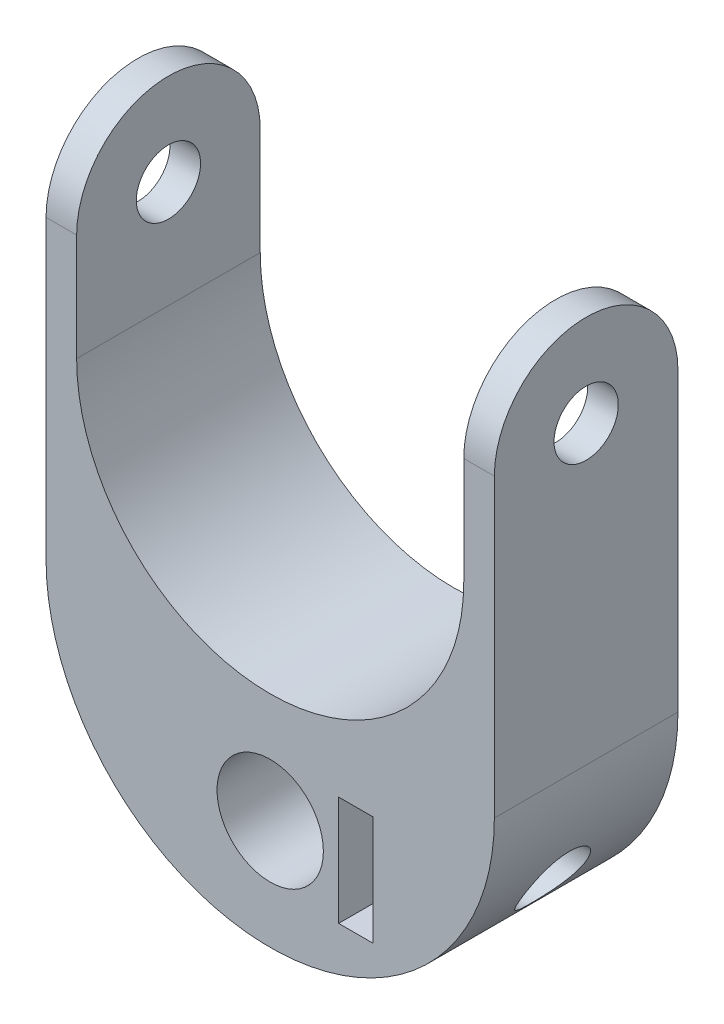
ISO-10303-21;
HEADER;
FILE_DESCRIPTION(('STEP AP214'),'2;1');
FILE_NAME('part.step','',(''),(''),'','','');
FILE_SCHEMA(('AUTOMOTIVE_DESIGN { 1 0 10303 214 1 1 1 1 }'));
ENDSEC;
DATA;
#1=APPLICATION_CONTEXT('core data for automotive mechanical design processes');
#2=APPLICATION_PROTOCOL_DEFINITION('international standard','automotive_design',2000,#1);
#3=PRODUCT_CONTEXT('',#1,'mechanical');
#4=PRODUCT('Part','Part','',(#3));
#5=PRODUCT_RELATED_PRODUCT_CATEGORY('part','',(#4));
#6=PRODUCT_DEFINITION_FORMATION('','',#4);
#7=PRODUCT_DEFINITION_CONTEXT('part definition',#1,'design');
#8=PRODUCT_DEFINITION('design','',#6,#7);
#9=PRODUCT_DEFINITION_SHAPE('','',#8);
#10=(LENGTH_UNIT() NAMED_UNIT(*) SI_UNIT(.MILLI.,.METRE.));
#11=(NAMED_UNIT(*) PLANE_ANGLE_UNIT() SI_UNIT($,.RADIAN.));
#12=(NAMED_UNIT(*) SI_UNIT($,.STERADIAN.) SOLID_ANGLE_UNIT());
#13=UNCERTAINTY_MEASURE_WITH_UNIT(LENGTH_MEASURE(1.E-05),#10,'distance_accuracy_value','');
#14=(GEOMETRIC_REPRESENTATION_CONTEXT(3) GLOBAL_UNCERTAINTY_ASSIGNED_CONTEXT((#13)) GLOBAL_UNIT_ASSIGNED_CONTEXT((#10,
#11,#12)) REPRESENTATION_CONTEXT('',''));
#15=CARTESIAN_POINT('',(0.,0.,0.));
#16=DIRECTION('',(0.,0.,1.));
#17=DIRECTION('',(1.,0.,0.));
#18=AXIS2_PLACEMENT_3D('',#15,#16,#17);
#19=CARTESIAN_POINT('',(0.,-5.35000000000001,12.));
#20=DIRECTION('',(0.,0.,-1.));
#21=DIRECTION('',(-1.,0.,0.));
#22=AXIS2_PLACEMENT_3D('',#19,#20,#21);
#23=CYLINDRICAL_SURFACE('',#22,14.65);
#24=CARTESIAN_POINT('',(0.,-5.35000000000001,0.));
#25=DIRECTION('',(0.,0.,1.));
#26=DIRECTION('',(1.,0.,0.));
#27=AXIS2_PLACEMENT_3D('',#24,#25,#26);
#28=CIRCLE('',#27,14.65);
#29=CARTESIAN_POINT('',(-14.65,-5.35,0.));
#30=VERTEX_POINT('',#29);
#31=CARTESIAN_POINT('',(14.65,-5.35,0.));
#32=VERTEX_POINT('',#31);
#33=EDGE_CURVE('E250',#30,#32,#28,.T.);
#34=ORIENTED_EDGE('',*,*,#33,.T.);
#35=DIRECTION('',(0.,0.,-1.));
#36=VECTOR('',#35,1.);
#37=CARTESIAN_POINT('',(14.65,-5.35,12.));
#38=LINE('',#37,#36);
#39=CARTESIAN_POINT('',(14.65,-5.35,12.));
#40=VERTEX_POINT('',#39);
#41=EDGE_CURVE('E266',#40,#32,#38,.T.);
#42=ORIENTED_EDGE('',*,*,#41,.F.);
#43=CARTESIAN_POINT('',(0.,-5.35000000000001,12.));
#44=DIRECTION('',(0.,0.,1.));
#45=DIRECTION('',(1.,0.,0.));
#46=AXIS2_PLACEMENT_3D('',#43,#44,#45);
#47=CIRCLE('',#46,14.65);
#48=CARTESIAN_POINT('',(-14.65,-5.35,12.));
#49=VERTEX_POINT('',#48);
#50=EDGE_CURVE('E233',#49,#40,#47,.T.);
#51=ORIENTED_EDGE('',*,*,#50,.F.);
#52=DIRECTION('',(0.,0.,-1.));
#53=VECTOR('',#52,1.);
#54=CARTESIAN_POINT('',(-14.65,-5.35,12.));
#55=LINE('',#54,#53);
#56=EDGE_CURVE('E269',#49,#30,#55,.T.);
#57=ORIENTED_EDGE('',*,*,#56,.T.);
#58=EDGE_LOOP('',(#34,#42,#51,#57));
#59=FACE_BOUND('',#58,.T.);
#60=CARTESIAN_POINT('',(13.6381816969859,-10.7,6.075));
#61=CARTESIAN_POINT('',(13.6381818577953,-10.6999997619216,6.18769592040529));
#62=CARTESIAN_POINT('',(13.6346630418073,-10.7089959253899,6.30039352296574));
#63=CARTESIAN_POINT('',(13.6206093448513,-10.7446140347678,6.52251853197071));
#64=CARTESIAN_POINT('',(13.610073919306,-10.7712373487657,6.63194568389816));
#65=CARTESIAN_POINT('',(13.5820759585504,-10.8410027991601,6.84432555055061));
#66=CARTESIAN_POINT('',(13.5646203092123,-10.8841285135943,6.94728458366681));
#67=CARTESIAN_POINT('',(13.5229397911344,-10.9852084332464,7.1441290452958));
#68=CARTESIAN_POINT('',(13.4987147387791,-11.0431630406846,7.23801422759345));
#69=CARTESIAN_POINT('',(13.4432080654823,-11.1730341139302,7.41628265225317));
#70=CARTESIAN_POINT('',(13.4117941209934,-11.2452083221933,7.50043637743475));
#71=CARTESIAN_POINT('',(13.3426264203627,-11.4001247207099,7.65530421032495));
#72=CARTESIAN_POINT('',(13.3048714448191,-11.4828689428789,7.72601572746477));
#73=CARTESIAN_POINT('',(13.2210359109427,-11.6616588660163,7.85693550890259));
#74=CARTESIAN_POINT('',(13.1745818981247,-11.758213169107,7.91620795309389));
#75=CARTESIAN_POINT('',(13.0759783957465,-11.9570887585952,8.01789608637373));
#76=CARTESIAN_POINT('',(13.0238267495519,-12.0594122215592,8.06030536414025));
#77=CARTESIAN_POINT('',(12.9093925221057,-12.2772393563958,8.13169051376206));
#78=CARTESIAN_POINT('',(12.8466180037451,-12.3930500061078,8.15893641107234));
#79=CARTESIAN_POINT('',(12.7166443724941,-12.625106883376,8.19383342562037));
#80=CARTESIAN_POINT('',(12.6494434721969,-12.741353268794,8.20147657674696));
#81=CARTESIAN_POINT('',(12.5037194092245,-12.9855775433663,8.19784956948757));
#82=CARTESIAN_POINT('',(12.424805685681,-13.1132878608272,8.18419795167279));
#83=CARTESIAN_POINT('',(12.2651174691782,-13.3632039763527,8.13466415688475));
#84=CARTESIAN_POINT('',(12.1843413588044,-13.4854046947377,8.09876189763443));
#85=CARTESIAN_POINT('',(12.0153828038357,-13.7331768672592,8.00120067306634));
#86=CARTESIAN_POINT('',(11.9272390736859,-13.8579326259775,7.9373877182541));
#87=CARTESIAN_POINT('',(11.7549451888421,-14.0944338378493,7.78495166703591));
#88=CARTESIAN_POINT('',(11.6707926560307,-14.206187097608,7.69634356741768));
#89=CARTESIAN_POINT('',(11.5297306701154,-14.3886892915543,7.51818284045546));
#90=CARTESIAN_POINT('',(11.4710311773009,-14.4629353678651,7.43362189426947));
#91=CARTESIAN_POINT('',(11.3616444861548,-14.5989523926377,7.25045032818825));
#92=CARTESIAN_POINT('',(11.3109447597664,-14.6607428901768,7.15186214562349));
#93=CARTESIAN_POINT('',(11.2298766677136,-14.7582726961813,6.96220300009554));
#94=CARTESIAN_POINT('',(11.197471545769,-14.7967423959774,6.87341488615511));
#95=CARTESIAN_POINT('',(11.1422693806021,-14.8617906519782,6.68873341822551));
#96=CARTESIAN_POINT('',(11.119465599557,-14.8883775478507,6.59284510261503));
#97=CARTESIAN_POINT('',(11.0852732488805,-14.9280963156938,6.39560336404526));
#98=CARTESIAN_POINT('',(11.0739609952478,-14.9411382472731,6.29421805462742));
#99=CARTESIAN_POINT('',(11.0641963862251,-14.9524020135628,6.09001701218399));
#100=CARTESIAN_POINT('',(11.0657386711715,-14.9506300248946,5.98720189316323));
#101=CARTESIAN_POINT('',(11.0806391746589,-14.933424688417,5.79483745430381));
#102=CARTESIAN_POINT('',(11.0927144170103,-14.9194745653258,5.70504655409754));
#103=CARTESIAN_POINT('',(11.125974867249,-14.8807831947313,5.52960622943799));
#104=CARTESIAN_POINT('',(11.1471615875259,-14.8560401557312,5.4439574951584));
#105=CARTESIAN_POINT('',(11.1984608614494,-14.7955602963951,5.2743605584242));
#106=CARTESIAN_POINT('',(11.2289621601351,-14.759341375658,5.19070465088623));
#107=CARTESIAN_POINT('',(11.2966752536619,-14.6779385526156,5.030821660794));
#108=CARTESIAN_POINT('',(11.3338920668399,-14.6327479434417,4.95460019988673));
#109=CARTESIAN_POINT('',(11.43231204544,-14.5115143705335,4.77582477030612));
#110=CARTESIAN_POINT('',(11.4965183239039,-14.4310056182378,4.67793339521184));
#111=CARTESIAN_POINT('',(11.6318298452881,-14.2570323817954,4.50005966604927));
#112=CARTESIAN_POINT('',(11.7029459318874,-14.1635474320531,4.42010613454492));
#113=CARTESIAN_POINT('',(11.8498835503259,-13.9649988580726,4.27745841067161));
#114=CARTESIAN_POINT('',(11.9257552409202,-13.8597972693325,4.21500898745246));
#115=CARTESIAN_POINT('',(12.078795297943,-13.6411417946528,4.10921990306699));
#116=CARTESIAN_POINT('',(12.1559635119425,-13.5276888736533,4.06587801157047));
#117=CARTESIAN_POINT('',(12.3212366210307,-13.2768789485465,3.99391320572146));
#118=CARTESIAN_POINT('',(12.409227158307,-13.1385045436946,3.96851519128338));
#119=CARTESIAN_POINT('',(12.5814872102261,-12.8570567518653,3.94555664678937));
#120=CARTESIAN_POINT('',(12.6657552634976,-12.7139815572217,3.94800695361157));
#121=CARTESIAN_POINT('',(12.8263176348531,-12.4305409571695,3.98215878301517));
#122=CARTESIAN_POINT('',(12.9027377858865,-12.2901786289499,4.01327388362695));
#123=CARTESIAN_POINT('',(13.047080301665,-12.0148550470874,4.10515499535342));
#124=CARTESIAN_POINT('',(13.1150108243851,-11.8798886944386,4.16589226197539));
#125=CARTESIAN_POINT('',(13.2328666547614,-11.637272389902,4.30799499988047));
#126=CARTESIAN_POINT('',(13.283970609951,-11.5282781377381,4.38608246284746));
#127=CARTESIAN_POINT('',(13.3766965762241,-11.3248624133218,4.56390545754581));
#128=CARTESIAN_POINT('',(13.4183268379757,-11.2304282839112,4.66362200344987));
#129=CARTESIAN_POINT('',(13.4867496846484,-11.071596180636,4.86839437123468));
#130=CARTESIAN_POINT('',(13.5147345305296,-11.0049368330417,4.97130386329456));
#131=CARTESIAN_POINT('',(13.5623354515674,-10.8898066313034,5.18858347918967));
#132=CARTESIAN_POINT('',(13.5819570563928,-10.8413237616646,5.3029459684723));
#133=CARTESIAN_POINT('',(13.6108942987721,-10.769169175805,5.52604155188967));
#134=CARTESIAN_POINT('',(13.6211219299528,-10.7433176728153,5.63395744921457));
#135=CARTESIAN_POINT('',(13.6347648666095,-10.7087349192348,5.85291544103542));
#136=CARTESIAN_POINT('',(13.6381815385349,-10.7000002345867,5.96395690393009));
#137=CARTESIAN_POINT('',(13.6381816969859,-10.7,6.075));
#138=B_SPLINE_CURVE_WITH_KNOTS('',3,(#60,#61,#62,#63,#64,#65,#66,#67,#68,#69,#70,#71,#72,#73,
#74,#75,#76,#77,#78,#79,#80,#81,#82,#83,#84,#85,#86,#87,#88,#89,#90,#91,#92,#93,#94,#95,#96,#97,
#98,#99,#100,#101,#102,#103,#104,#105,#106,#107,#108,#109,#110,#111,#112,#113,#114,#115,#116,
#117,#118,#119,#120,#121,#122,#123,#124,#125,#126,#127,#128,#129,#130,#131,#132,#133,#134,#135,
#136,#137),.UNSPECIFIED.,.T.,.F.,(4,2,2,2,2,2,2,2,2,2,2,2,2,2,2,2,2,2,2,2,2,2,2,2,2,2,2,2,2,2,2,
2,2,2,2,2,2,2,4),(0.,0.337682439300935,0.675391090073539,1.01276454859304,1.35014715903191,
1.69432634265536,2.03857178904914,2.40438860401935,2.77034436869361,3.17226811443252,
3.57435516699902,4.02472756617836,4.4755070413216,4.96985375011932,5.46390210824802,
5.8432923914678,6.22208250273881,6.527009874636,6.83172290304397,7.13844657633429,
7.44504236845139,7.71880682332976,7.99261673718104,8.27993331275058,8.56746548877962,
8.99140722412871,9.4160253475027,9.84631447539007,10.2765533643917,10.7719762402542,
11.2675919112601,11.7532882180636,12.2385141541468,12.6665087679083,13.0941292010936,
13.4694250934576,13.8444724585549,14.1772691434822,14.5099990543216),.UNSPECIFIED.);
#139=CARTESIAN_POINT('',(13.6381816969859,-10.7,6.075));
#140=VERTEX_POINT('',#139);
#141=EDGE_CURVE('E184',#140,#140,#138,.T.);
#142=ORIENTED_EDGE('',*,*,#141,.F.);
#143=EDGE_LOOP('',(#142));
#144=FACE_BOUND('',#143,.T.);
#145=ADVANCED_FACE('F66',(#59,#144),#23,.T.);
#146=CARTESIAN_POINT('',(0.,-12.825,12.));
#147=DIRECTION('',(0.,0.,-1.));
#148=DIRECTION('',(-1.,0.,0.));
#149=AXIS2_PLACEMENT_3D('',#146,#147,#148);
#150=CYLINDRICAL_SURFACE('',#149,3.475);
#151=CARTESIAN_POINT('',(0.,-12.825,0.));
#152=DIRECTION('',(0.,0.,1.));
#153=DIRECTION('',(1.,0.,0.));
#154=AXIS2_PLACEMENT_3D('',#151,#152,#153);
#155=CIRCLE('',#154,3.475);
#156=CARTESIAN_POINT('',(3.475,-12.825,0.));
#157=VERTEX_POINT('',#156);
#158=EDGE_CURVE('E226',#157,#157,#155,.T.);
#159=ORIENTED_EDGE('',*,*,#158,.F.);
#160=EDGE_LOOP('',(#159));
#161=FACE_BOUND('',#160,.T.);
#162=CARTESIAN_POINT('',(0.,-12.825,12.));
#163=DIRECTION('',(0.,0.,1.));
#164=DIRECTION('',(1.,0.,0.));
#165=AXIS2_PLACEMENT_3D('',#162,#163,#164);
#166=CIRCLE('',#165,3.475);
#167=CARTESIAN_POINT('',(3.475,-12.825,12.));
#168=VERTEX_POINT('',#167);
#169=EDGE_CURVE('E227',#168,#168,#166,.T.);
#170=ORIENTED_EDGE('',*,*,#169,.T.);
#171=EDGE_LOOP('',(#170));
#172=FACE_BOUND('',#171,.T.);
#173=CARTESIAN_POINT('',(2.74954541697351,-10.7,6.075));
#174=CARTESIAN_POINT('',(2.74955663550866,-10.7000073124976,6.18118933079543));
#175=CARTESIAN_POINT('',(2.75581041288415,-10.7080317626719,6.2875687626639));
#176=CARTESIAN_POINT('',(2.77975066762319,-10.7395804219011,6.49681047887194));
#177=CARTESIAN_POINT('',(2.7974711140295,-10.7631506881382,6.59966135376265));
#178=CARTESIAN_POINT('',(2.84142161463842,-10.8241668028883,6.79818137578376));
#179=CARTESIAN_POINT('',(2.86758040800459,-10.8614968159188,6.89390267867532));
#180=CARTESIAN_POINT('',(2.92533707753917,-10.9486324823229,7.0776057600308));
#181=CARTESIAN_POINT('',(2.95693465765566,-10.9984374567085,7.16558795936712));
#182=CARTESIAN_POINT('',(3.02688544143902,-11.1165288664044,7.34369186381119));
#183=CARTESIAN_POINT('',(3.06558600683897,-11.1863634648647,7.43265109772106));
#184=CARTESIAN_POINT('',(3.14258950929754,-11.3393675342977,7.59857142485001));
#185=CARTESIAN_POINT('',(3.18089208348308,-11.4225482017905,7.67552233595959));
#186=CARTESIAN_POINT('',(3.25794017578133,-11.6113370835735,7.82389667814463));
#187=CARTESIAN_POINT('',(3.29624124183253,-11.7184198275929,7.893697809387));
#188=CARTESIAN_POINT('',(3.36396675771904,-11.945596917334,8.01374421887085));
#189=CARTESIAN_POINT('',(3.39339966969831,-12.0656787094278,8.06400815321127));
#190=CARTESIAN_POINT('',(3.43747331427917,-12.3029824267362,8.13825494690161));
#191=CARTESIAN_POINT('',(3.45328375215388,-12.4193250451812,8.16433561577177));
#192=CARTESIAN_POINT('',(3.47289100064203,-12.6556937465318,8.19659025428263));
#193=CARTESIAN_POINT('',(3.47669970921447,-12.7757160622591,8.20278393907456));
#194=CARTESIAN_POINT('',(3.47219082722594,-12.9993656029482,8.19540195811891));
#195=CARTESIAN_POINT('',(3.46537026846804,-13.1031155614167,8.18426714246096));
#196=CARTESIAN_POINT('',(3.44294423097086,-13.306944157982,8.14721695089413));
#197=CARTESIAN_POINT('',(3.42733808877937,-13.4070225182065,8.12130045873006));
#198=CARTESIAN_POINT('',(3.38859791959663,-13.6014754160236,8.0557311603107));
#199=CARTESIAN_POINT('',(3.36543123650636,-13.6958230657459,8.01601871660944));
#200=CARTESIAN_POINT('',(3.31339664948914,-13.8766123886235,7.92432980681556));
#201=CARTESIAN_POINT('',(3.2845273511498,-13.9630521205435,7.87235034056488));
#202=CARTESIAN_POINT('',(3.21935751165941,-14.1368650914298,7.75048064203681));
#203=CARTESIAN_POINT('',(3.18258011961935,-14.2230692484577,7.67917989447444));
#204=CARTESIAN_POINT('',(3.10740745076104,-14.3830356946768,7.52433342865892));
#205=CARTESIAN_POINT('',(3.06900995879591,-14.4567802104114,7.44077053069678));
#206=CARTESIAN_POINT('',(2.98936807406538,-14.5988975408982,7.25167863117997));
#207=CARTESIAN_POINT('',(2.94835192332348,-14.6655028898953,7.14471257032144));
#208=CARTESIAN_POINT('',(2.87407323927726,-14.779476049359,6.91856605244707));
#209=CARTESIAN_POINT('',(2.84079640880218,-14.8268794545449,6.79940871304383));
#210=CARTESIAN_POINT('',(2.7946803833998,-14.8905556751554,6.58329259061401));
#211=CARTESIAN_POINT('',(2.7787938242496,-14.9116835683561,6.48841686035726));
#212=CARTESIAN_POINT('',(2.75672637919793,-14.9407581076104,6.29560524020313));
#213=CARTESIAN_POINT('',(2.75053332305873,-14.9487212827358,6.19767334523348));
#214=CARTESIAN_POINT('',(2.74877629019918,-14.9509956234298,6.00138021477389));
#215=CARTESIAN_POINT('',(2.75323118756035,-14.945282547065,5.90301852584371));
#216=CARTESIAN_POINT('',(2.77211789140151,-14.920523133347,5.70894570498752));
#217=CARTESIAN_POINT('',(2.7865577847179,-14.9014659884905,5.61323678693308));
#218=CARTESIAN_POINT('',(2.82328595864755,-14.851234764115,5.42755317109157));
#219=CARTESIAN_POINT('',(2.84551149443271,-14.8201573538416,5.33753922911935));
#220=CARTESIAN_POINT('',(2.89541719845938,-14.7470148092791,5.16374543668898));
#221=CARTESIAN_POINT('',(2.92309936092263,-14.704945656026,5.07996788089702));
#222=CARTESIAN_POINT('',(2.98698232392946,-14.6020390068488,4.90456201979293));
#223=CARTESIAN_POINT('',(3.02381122878593,-14.5391684062932,4.81435425851032));
#224=CARTESIAN_POINT('',(3.0983314156272,-14.4004925914824,4.64480376438608));
#225=CARTESIAN_POINT('',(3.13602352616291,-14.3246744567123,4.56547202884001));
#226=CARTESIAN_POINT('',(3.21439144487114,-14.1493105928317,4.40838973270698));
#227=CARTESIAN_POINT('',(3.2547190974572,-14.0479211820631,4.33250015846544));
#228=CARTESIAN_POINT('',(3.32806442904216,-13.8313076263707,4.1990693867223));
#229=CARTESIAN_POINT('',(3.36108637558465,-13.7160916190901,4.14151746879535));
#230=CARTESIAN_POINT('',(3.41410460816077,-13.4828944389331,4.05080394572184));
#231=CARTESIAN_POINT('',(3.43482892653676,-13.3656232793294,4.01625965767993));
#232=CARTESIAN_POINT('',(3.46408887997346,-13.1254672354185,3.96779904857107));
#233=CARTESIAN_POINT('',(3.47263967779769,-13.0025895316921,3.95385706542043));
#234=CARTESIAN_POINT('',(3.47623850743273,-12.7734135445383,3.94797717856349));
#235=CARTESIAN_POINT('',(3.47300935052631,-12.667202576841,3.95323193454088));
#236=CARTESIAN_POINT('',(3.45710731571278,-12.4574565879312,3.97936163410318));
#237=CARTESIAN_POINT('',(3.44443454995827,-12.3539215349547,4.00023639218448));
#238=CARTESIAN_POINT('',(3.41122142197937,-12.1548131994301,4.05586334936519));
#239=CARTESIAN_POINT('',(3.39087911274524,-12.0591077944626,4.09026707593465));
#240=CARTESIAN_POINT('',(3.34393501861401,-11.8748564773307,4.1715815145659));
#241=CARTESIAN_POINT('',(3.31733202454343,-11.7863119526457,4.2184946428964));
#242=CARTESIAN_POINT('',(3.25667029744409,-11.608675027187,4.3290715090804));
#243=CARTESIAN_POINT('',(3.22211876082524,-11.5205337710871,4.39398899884529));
#244=CARTESIAN_POINT('',(3.15038980053433,-11.3557260331393,4.53593874060285));
#245=CARTESIAN_POINT('',(3.11320936896338,-11.2790730190003,4.61298499766877));
#246=CARTESIAN_POINT('',(3.03421203021802,-11.1287328616593,4.78912582265117));
#247=CARTESIAN_POINT('',(2.99244825755703,-11.0568494368204,4.88979307170712));
#248=CARTESIAN_POINT('',(2.91437307638363,-10.9309160389483,5.10369624102247));
#249=CARTESIAN_POINT('',(2.87805774452393,-10.8768531996488,5.21692301415594));
#250=CARTESIAN_POINT('',(2.82338827629477,-10.7987096408345,5.42737539872225));
#251=CARTESIAN_POINT('',(2.80283510301014,-10.7706326756413,5.52254609423514));
#252=CARTESIAN_POINT('',(2.77107934564827,-10.7279847155294,5.71722161130982));
#253=CARTESIAN_POINT('',(2.75984602105387,-10.7133693014192,5.81671103599903));
#254=CARTESIAN_POINT('',(2.75257651090834,-10.7039275361004,5.94317941434143));
#255=CARTESIAN_POINT('',(2.75144264473066,-10.7024565966041,5.96950388056349));
#256=CARTESIAN_POINT('',(2.74992563334259,-10.7004918285478,6.02221497462059));
#257=CARTESIAN_POINT('',(2.74954262807533,-10.6999981821324,6.04860161312579));
#258=CARTESIAN_POINT('',(2.74954541697351,-10.7,6.075));
#259=B_SPLINE_CURVE_WITH_KNOTS('',3,(#173,#174,#175,#176,#177,#178,#179,#180,#181,#182,#183,
#184,#185,#186,#187,#188,#189,#190,#191,#192,#193,#194,#195,#196,#197,#198,#199,#200,#201,#202,
#203,#204,#205,#206,#207,#208,#209,#210,#211,#212,#213,#214,#215,#216,#217,#218,#219,#220,#221,
#222,#223,#224,#225,#226,#227,#228,#229,#230,#231,#232,#233,#234,#235,#236,#237,#238,#239,#240,
#241,#242,#243,#244,#245,#246,#247,#248,#249,#250,#251,#252,#253,#254,#255,#256,#257,#258),
.UNSPECIFIED.,.T.,.F.,(4,2,2,2,2,2,2,2,2,2,2,2,2,2,2,2,2,2,2,2,2,2,2,2,2,2,2,2,2,2,2,2,2,2,2,2,
2,2,2,2,2,2,4),(0.,0.318446467834447,0.637840652327823,0.954605260761244,1.27135263205435,
1.62856320410945,1.98607503576495,2.38422086627301,2.78198556718853,3.14064818570288,
3.4989551306533,3.81116522238973,4.12339889415011,4.43699944637281,4.75067677582807,
5.10256668945883,5.45495440563799,5.85055175320695,6.24541238714062,6.5396298615089,
6.8334776473324,7.12784668063116,7.42245440272542,7.71474051019013,8.00713363755412,
8.35369074914949,8.70059573745206,9.09728827024466,9.49374846424898,9.86348198816168,
10.2327545853032,10.550328364695,10.8678983726309,11.1777743692844,11.487710263825,
11.8307422105034,12.1741732011138,12.5640590908889,12.9536628676243,13.2564695291149,
13.5582733994265,13.6374235990001,13.7165885489405),.UNSPECIFIED.);
#260=CARTESIAN_POINT('',(2.74954541697351,-10.7,6.075));
#261=VERTEX_POINT('',#260);
#262=EDGE_CURVE('E371',#261,#261,#259,.T.);
#263=ORIENTED_EDGE('',*,*,#262,.T.);
#264=EDGE_LOOP('',(#263));
#265=FACE_BOUND('',#264,.T.);
#266=ADVANCED_FACE('F68',(#161,#172,#265),#150,.F.);
#267=CARTESIAN_POINT('',(-14.65,0.,12.));
#268=DIRECTION('',(1.,0.,0.));
#269=DIRECTION('',(0.,1.,0.));
#270=AXIS2_PLACEMENT_3D('',#267,#268,#269);
#271=PLANE('',#270);
#272=CARTESIAN_POINT('',(-14.65,14.,6.));
#273=DIRECTION('',(-1.,0.,0.));
#274=DIRECTION('',(0.,0.,1.));
#275=AXIS2_PLACEMENT_3D('',#272,#273,#274);
#276=CIRCLE('',#275,6.);
#277=CARTESIAN_POINT('',(-14.65,14.,0.));
#278=VERTEX_POINT('',#277);
#279=CARTESIAN_POINT('',(-14.65,14.,12.));
#280=VERTEX_POINT('',#279);
#281=EDGE_CURVE('E216',#278,#280,#276,.F.);
#282=ORIENTED_EDGE('',*,*,#281,.F.);
#283=DIRECTION('',(0.,-1.,0.));
#284=VECTOR('',#283,1.);
#285=CARTESIAN_POINT('',(-14.65,0.,0.));
#286=LINE('',#285,#284);
#287=EDGE_CURVE('E248',#278,#30,#286,.T.);
#288=ORIENTED_EDGE('',*,*,#287,.T.);
#289=ORIENTED_EDGE('',*,*,#56,.F.);
#290=DIRECTION('',(0.,-1.,0.));
#291=VECTOR('',#290,1.);
#292=CARTESIAN_POINT('',(-14.65,0.,12.));
#293=LINE('',#292,#291);
#294=EDGE_CURVE('E230',#280,#49,#293,.T.);
#295=ORIENTED_EDGE('',*,*,#294,.F.);
#296=EDGE_LOOP('',(#282,#288,#289,#295));
#297=FACE_BOUND('',#296,.T.);
#298=CARTESIAN_POINT('',(-14.65,14.,6.));
#299=DIRECTION('',(-1.,0.,0.));
#300=DIRECTION('',(0.,0.,1.));
#301=AXIS2_PLACEMENT_3D('',#298,#299,#300);
#302=CIRCLE('',#301,2.1);
#303=CARTESIAN_POINT('',(-14.65,14.,8.1));
#304=VERTEX_POINT('',#303);
#305=EDGE_CURVE('E205',#304,#304,#302,.T.);
#306=ORIENTED_EDGE('',*,*,#305,.F.);
#307=EDGE_LOOP('',(#306));
#308=FACE_BOUND('',#307,.T.);
#309=ADVANCED_FACE('F303',(#297,#308),#271,.F.);
#310=CARTESIAN_POINT('',(14.65,0.,12.));
#311=DIRECTION('',(1.,0.,0.));
#312=DIRECTION('',(0.,1.,0.));
#313=AXIS2_PLACEMENT_3D('',#310,#311,#312);
#314=PLANE('',#313);
#315=DIRECTION('',(0.,-1.,0.));
#316=VECTOR('',#315,1.);
#317=CARTESIAN_POINT('',(14.65,0.,0.));
#318=LINE('',#317,#316);
#319=CARTESIAN_POINT('',(14.65,14.,0.));
#320=VERTEX_POINT('',#319);
#321=EDGE_CURVE('E253',#320,#32,#318,.T.);
#322=ORIENTED_EDGE('',*,*,#321,.F.);
#323=CARTESIAN_POINT('',(14.65,14.,6.));
#324=DIRECTION('',(-1.,0.,0.));
#325=DIRECTION('',(0.,0.,1.));
#326=AXIS2_PLACEMENT_3D('',#323,#324,#325);
#327=CIRCLE('',#326,6.);
#328=CARTESIAN_POINT('',(14.65,14.,12.));
#329=VERTEX_POINT('',#328);
#330=EDGE_CURVE('E217',#320,#329,#327,.F.);
#331=ORIENTED_EDGE('',*,*,#330,.T.);
#332=DIRECTION('',(0.,-1.,0.));
#333=VECTOR('',#332,1.);
#334=CARTESIAN_POINT('',(14.65,0.,12.));
#335=LINE('',#334,#333);
#336=EDGE_CURVE('E236',#329,#40,#335,.T.);
#337=ORIENTED_EDGE('',*,*,#336,.T.);
#338=ORIENTED_EDGE('',*,*,#41,.T.);
#339=EDGE_LOOP('',(#322,#331,#337,#338));
#340=FACE_BOUND('',#339,.T.);
#341=CARTESIAN_POINT('',(14.65,14.,6.));
#342=DIRECTION('',(-1.,0.,0.));
#343=DIRECTION('',(0.,0.,1.));
#344=AXIS2_PLACEMENT_3D('',#341,#342,#343);
#345=CIRCLE('',#344,2.1);
#346=CARTESIAN_POINT('',(14.65,14.,8.1));
#347=VERTEX_POINT('',#346);
#348=EDGE_CURVE('E201',#347,#347,#345,.T.);
#349=ORIENTED_EDGE('',*,*,#348,.T.);
#350=EDGE_LOOP('',(#349));
#351=FACE_BOUND('',#350,.T.);
#352=ADVANCED_FACE('F292',(#340,#351),#314,.T.);
#353=CARTESIAN_POINT('',(12.65,0.,12.));
#354=DIRECTION('',(1.,0.,0.));
#355=DIRECTION('',(0.,1.,0.));
#356=AXIS2_PLACEMENT_3D('',#353,#354,#355);
#357=PLANE('',#356);
#358=CARTESIAN_POINT('',(12.65,14.,6.));
#359=DIRECTION('',(1.,0.,0.));
#360=DIRECTION('',(0.,1.,0.));
#361=AXIS2_PLACEMENT_3D('',#358,#359,#360);
#362=CIRCLE('',#361,6.);
#363=CARTESIAN_POINT('',(12.65,14.,12.));
#364=VERTEX_POINT('',#363);
#365=CARTESIAN_POINT('',(12.65,14.,0.));
#366=VERTEX_POINT('',#365);
#367=EDGE_CURVE('E92',#364,#366,#362,.F.);
#368=ORIENTED_EDGE('',*,*,#367,.T.);
#369=DIRECTION('',(0.,-1.,0.));
#370=VECTOR('',#369,1.);
#371=CARTESIAN_POINT('',(12.65,0.,0.));
#372=LINE('',#371,#370);
#373=CARTESIAN_POINT('',(12.65,7.00500000000042,0.));
#374=VERTEX_POINT('',#373);
#375=EDGE_CURVE('E255',#366,#374,#372,.T.);
#376=ORIENTED_EDGE('',*,*,#375,.T.);
#377=DIRECTION('',(0.,0.,-1.));
#378=VECTOR('',#377,1.);
#379=CARTESIAN_POINT('',(12.65,7.00500000000042,12.));
#380=LINE('',#379,#378);
#381=CARTESIAN_POINT('',(12.65,7.00500000000042,12.));
#382=VERTEX_POINT('',#381);
#383=EDGE_CURVE('E263',#382,#374,#380,.T.);
#384=ORIENTED_EDGE('',*,*,#383,.F.);
#385=DIRECTION('',(0.,-1.,0.));
#386=VECTOR('',#385,1.);
#387=CARTESIAN_POINT('',(12.65,0.,12.));
#388=LINE('',#387,#386);
#389=EDGE_CURVE('E238',#364,#382,#388,.T.);
#390=ORIENTED_EDGE('',*,*,#389,.F.);
#391=EDGE_LOOP('',(#368,#376,#384,#390));
#392=FACE_BOUND('',#391,.T.);
#393=CARTESIAN_POINT('',(12.65,14.,6.));
#394=DIRECTION('',(1.,0.,0.));
#395=DIRECTION('',(0.,1.,0.));
#396=AXIS2_PLACEMENT_3D('',#393,#394,#395);
#397=CIRCLE('',#396,2.1);
#398=CARTESIAN_POINT('',(12.65,16.1,6.));
#399=VERTEX_POINT('',#398);
#400=EDGE_CURVE('E213',#399,#399,#397,.T.);
#401=ORIENTED_EDGE('',*,*,#400,.T.);
#402=EDGE_LOOP('',(#401));
#403=FACE_BOUND('',#402,.T.);
#404=ADVANCED_FACE('F281',(#392,#403),#357,.F.);
#405=CARTESIAN_POINT('',(-12.65,0.,12.));
#406=DIRECTION('',(1.,0.,0.));
#407=DIRECTION('',(0.,1.,0.));
#408=AXIS2_PLACEMENT_3D('',#405,#406,#407);
#409=PLANE('',#408);
#410=DIRECTION('',(0.,-1.,0.));
#411=VECTOR('',#410,1.);
#412=CARTESIAN_POINT('',(-12.65,0.,0.));
#413=LINE('',#412,#411);
#414=CARTESIAN_POINT('',(-12.65,14.,0.));
#415=VERTEX_POINT('',#414);
#416=CARTESIAN_POINT('',(-12.65,7.00500000000042,0.));
#417=VERTEX_POINT('',#416);
#418=EDGE_CURVE('E231',#415,#417,#413,.T.);
#419=ORIENTED_EDGE('',*,*,#418,.F.);
#420=CARTESIAN_POINT('',(-12.65,14.,6.));
#421=DIRECTION('',(1.,0.,0.));
#422=DIRECTION('',(0.,1.,0.));
#423=AXIS2_PLACEMENT_3D('',#420,#421,#422);
#424=CIRCLE('',#423,6.);
#425=CARTESIAN_POINT('',(-12.65,14.,12.));
#426=VERTEX_POINT('',#425);
#427=EDGE_CURVE('E223',#426,#415,#424,.F.);
#428=ORIENTED_EDGE('',*,*,#427,.F.);
#429=DIRECTION('',(0.,-1.,0.));
#430=VECTOR('',#429,1.);
#431=CARTESIAN_POINT('',(-12.65,0.,12.));
#432=LINE('',#431,#430);
#433=CARTESIAN_POINT('',(-12.65,7.00500000000042,12.));
#434=VERTEX_POINT('',#433);
#435=EDGE_CURVE('E243',#426,#434,#432,.T.);
#436=ORIENTED_EDGE('',*,*,#435,.T.);
#437=DIRECTION('',(0.,0.,-1.));
#438=VECTOR('',#437,1.);
#439=CARTESIAN_POINT('',(-12.65,7.00500000000042,12.));
#440=LINE('',#439,#438);
#441=EDGE_CURVE('E245',#434,#417,#440,.T.);
#442=ORIENTED_EDGE('',*,*,#441,.T.);
#443=EDGE_LOOP('',(#419,#428,#436,#442));
#444=FACE_BOUND('',#443,.T.);
#445=CARTESIAN_POINT('',(-12.65,14.,6.));
#446=DIRECTION('',(1.,0.,0.));
#447=DIRECTION('',(0.,1.,0.));
#448=AXIS2_PLACEMENT_3D('',#445,#446,#447);
#449=CIRCLE('',#448,2.1);
#450=CARTESIAN_POINT('',(-12.65,16.1,6.));
#451=VERTEX_POINT('',#450);
#452=EDGE_CURVE('E212',#451,#451,#449,.T.);
#453=ORIENTED_EDGE('',*,*,#452,.F.);
#454=EDGE_LOOP('',(#453));
#455=FACE_BOUND('',#454,.T.);
#456=ADVANCED_FACE('F278',(#444,#455),#409,.T.);
#457=CARTESIAN_POINT('',(0.,7.00500000000042,12.));
#458=DIRECTION('',(0.,0.,-1.));
#459=DIRECTION('',(-1.,0.,0.));
#460=AXIS2_PLACEMENT_3D('',#457,#458,#459);
#461=CYLINDRICAL_SURFACE('',#460,12.65);
#462=CARTESIAN_POINT('',(0.,7.00500000000042,0.));
#463=DIRECTION('',(0.,0.,1.));
#464=DIRECTION('',(1.,0.,0.));
#465=AXIS2_PLACEMENT_3D('',#462,#463,#464);
#466=CIRCLE('',#465,12.65);
#467=EDGE_CURVE('E257',#417,#374,#466,.T.);
#468=ORIENTED_EDGE('',*,*,#467,.F.);
#469=ORIENTED_EDGE('',*,*,#441,.F.);
#470=CARTESIAN_POINT('',(0.,7.00500000000042,12.));
#471=DIRECTION('',(0.,0.,1.));
#472=DIRECTION('',(1.,0.,0.));
#473=AXIS2_PLACEMENT_3D('',#470,#471,#472);
#474=CIRCLE('',#473,12.65);
#475=EDGE_CURVE('E240',#434,#382,#474,.T.);
#476=ORIENTED_EDGE('',*,*,#475,.T.);
#477=ORIENTED_EDGE('',*,*,#383,.T.);
#478=EDGE_LOOP('',(#468,#469,#476,#477));
#479=FACE_BOUND('',#478,.T.);
#480=ADVANCED_FACE('F280',(#479),#461,.F.);
#481=CARTESIAN_POINT('',(0.,0.,12.));
#482=DIRECTION('',(0.,0.,1.));
#483=DIRECTION('',(1.,0.,0.));
#484=AXIS2_PLACEMENT_3D('',#481,#482,#483);
#485=PLANE('',#484);
#486=DIRECTION('',(0.,1.,0.));
#487=VECTOR('',#486,1.);
#488=CARTESIAN_POINT('',(6.725,-9.25,12.));
#489=LINE('',#488,#487);
#490=CARTESIAN_POINT('',(6.725,-16.4,12.));
#491=VERTEX_POINT('',#490);
#492=CARTESIAN_POINT('',(6.725,-9.25,12.));
#493=VERTEX_POINT('',#492);
#494=EDGE_CURVE('E84',#491,#493,#489,.T.);
#495=ORIENTED_EDGE('',*,*,#494,.F.);
#496=DIRECTION('',(1.,0.,0.));
#497=VECTOR('',#496,1.);
#498=CARTESIAN_POINT('',(4.475,-16.4,12.));
#499=LINE('',#498,#497);
#500=CARTESIAN_POINT('',(4.475,-16.4,12.));
#501=VERTEX_POINT('',#500);
#502=EDGE_CURVE('E178',#501,#491,#499,.T.);
#503=ORIENTED_EDGE('',*,*,#502,.F.);
#504=DIRECTION('',(0.,-1.,0.));
#505=VECTOR('',#504,1.);
#506=CARTESIAN_POINT('',(4.475,-9.25,12.));
#507=LINE('',#506,#505);
#508=CARTESIAN_POINT('',(4.475,-9.25,12.));
#509=VERTEX_POINT('',#508);
#510=EDGE_CURVE('E181',#509,#501,#507,.T.);
#511=ORIENTED_EDGE('',*,*,#510,.F.);
#512=DIRECTION('',(-1.,0.,0.));
#513=VECTOR('',#512,1.);
#514=CARTESIAN_POINT('',(4.475,-9.25,12.));
#515=LINE('',#514,#513);
#516=EDGE_CURVE('E195',#493,#509,#515,.T.);
#517=ORIENTED_EDGE('',*,*,#516,.F.);
#518=EDGE_LOOP('',(#495,#503,#511,#517));
#519=FACE_BOUND('',#518,.T.);
#520=DIRECTION('',(-1.,0.,0.));
#521=VECTOR('',#520,1.);
#522=CARTESIAN_POINT('',(14.65,14.,12.));
#523=LINE('',#522,#521);
#524=EDGE_CURVE('E76',#280,#426,#523,.F.);
#525=ORIENTED_EDGE('',*,*,#524,.F.);
#526=ORIENTED_EDGE('',*,*,#294,.T.);
#527=ORIENTED_EDGE('',*,*,#50,.T.);
#528=ORIENTED_EDGE('',*,*,#336,.F.);
#529=DIRECTION('',(-1.,0.,0.));
#530=VECTOR('',#529,1.);
#531=CARTESIAN_POINT('',(14.65,14.,12.));
#532=LINE('',#531,#530);
#533=EDGE_CURVE('E220',#329,#364,#532,.T.);
#534=ORIENTED_EDGE('',*,*,#533,.T.);
#535=ORIENTED_EDGE('',*,*,#389,.T.);
#536=ORIENTED_EDGE('',*,*,#475,.F.);
#537=ORIENTED_EDGE('',*,*,#435,.F.);
#538=EDGE_LOOP('',(#525,#526,#527,#528,#534,#535,#536,#537));
#539=FACE_BOUND('',#538,.T.);
#540=ORIENTED_EDGE('',*,*,#169,.F.);
#541=EDGE_LOOP('',(#540));
#542=FACE_BOUND('',#541,.T.);
#543=ADVANCED_FACE('F289',(#519,#539,#542),#485,.T.);
#544=CARTESIAN_POINT('',(0.,0.,0.));
#545=DIRECTION('',(0.,0.,1.));
#546=DIRECTION('',(1.,0.,0.));
#547=AXIS2_PLACEMENT_3D('',#544,#545,#546);
#548=PLANE('',#547);
#549=ORIENTED_EDGE('',*,*,#158,.T.);
#550=EDGE_LOOP('',(#549));
#551=FACE_BOUND('',#550,.T.);
#552=ORIENTED_EDGE('',*,*,#287,.F.);
#553=DIRECTION('',(-1.,0.,0.));
#554=VECTOR('',#553,1.);
#555=CARTESIAN_POINT('',(14.65,14.,0.));
#556=LINE('',#555,#554);
#557=EDGE_CURVE('E12',#278,#415,#556,.F.);
#558=ORIENTED_EDGE('',*,*,#557,.T.);
#559=ORIENTED_EDGE('',*,*,#418,.T.);
#560=ORIENTED_EDGE('',*,*,#467,.T.);
#561=ORIENTED_EDGE('',*,*,#375,.F.);
#562=DIRECTION('',(-1.,0.,0.));
#563=VECTOR('',#562,1.);
#564=CARTESIAN_POINT('',(14.65,14.,0.));
#565=LINE('',#564,#563);
#566=EDGE_CURVE('E208',#320,#366,#565,.T.);
#567=ORIENTED_EDGE('',*,*,#566,.F.);
#568=ORIENTED_EDGE('',*,*,#321,.T.);
#569=ORIENTED_EDGE('',*,*,#33,.F.);
#570=EDGE_LOOP('',(#552,#558,#559,#560,#561,#567,#568,#569));
#571=FACE_BOUND('',#570,.T.);
#572=ADVANCED_FACE('F334',(#551,#571),#548,.F.);
#573=CARTESIAN_POINT('',(14.65,14.,6.));
#574=DIRECTION('',(-1.,0.,0.));
#575=DIRECTION('',(0.,0.,1.));
#576=AXIS2_PLACEMENT_3D('',#573,#574,#575);
#577=CYLINDRICAL_SURFACE('',#576,6.);
#578=ORIENTED_EDGE('',*,*,#533,.F.);
#579=ORIENTED_EDGE('',*,*,#330,.F.);
#580=ORIENTED_EDGE('',*,*,#566,.T.);
#581=ORIENTED_EDGE('',*,*,#367,.F.);
#582=EDGE_LOOP('',(#578,#579,#580,#581));
#583=FACE_BOUND('',#582,.T.);
#584=ADVANCED_FACE('F327',(#583),#577,.T.);
#585=ORIENTED_EDGE('',*,*,#427,.T.);
#586=ORIENTED_EDGE('',*,*,#557,.F.);
#587=ORIENTED_EDGE('',*,*,#281,.T.);
#588=ORIENTED_EDGE('',*,*,#524,.T.);
#589=EDGE_LOOP('',(#585,#586,#587,#588));
#590=FACE_BOUND('',#589,.T.);
#591=ADVANCED_FACE('F320',(#590),#577,.T.);
#592=CARTESIAN_POINT('',(14.65,14.,6.));
#593=DIRECTION('',(-1.,0.,0.));
#594=DIRECTION('',(0.,0.,1.));
#595=AXIS2_PLACEMENT_3D('',#592,#593,#594);
#596=CYLINDRICAL_SURFACE('',#595,2.1);
#597=ORIENTED_EDGE('',*,*,#452,.T.);
#598=EDGE_LOOP('',(#597));
#599=FACE_BOUND('',#598,.T.);
#600=ORIENTED_EDGE('',*,*,#305,.T.);
#601=EDGE_LOOP('',(#600));
#602=FACE_BOUND('',#601,.T.);
#603=ADVANCED_FACE('F275',(#599,#602),#596,.F.);
#604=ORIENTED_EDGE('',*,*,#348,.F.);
#605=EDGE_LOOP('',(#604));
#606=FACE_BOUND('',#605,.T.);
#607=ORIENTED_EDGE('',*,*,#400,.F.);
#608=EDGE_LOOP('',(#607));
#609=FACE_BOUND('',#608,.T.);
#610=ADVANCED_FACE('F319',(#606,#609),#596,.F.);
#611=CARTESIAN_POINT('',(6.725,-9.25,2.5));
#612=DIRECTION('',(1.,0.,0.));
#613=DIRECTION('',(0.,0.,-1.));
#614=AXIS2_PLACEMENT_3D('',#611,#612,#613);
#615=PLANE('',#614);
#616=CARTESIAN_POINT('',(6.725,-12.825,6.075));
#617=DIRECTION('',(1.,0.,0.));
#618=DIRECTION('',(0.,0.,-1.));
#619=AXIS2_PLACEMENT_3D('',#616,#617,#618);
#620=CIRCLE('',#619,2.125);
#621=CARTESIAN_POINT('',(6.725,-12.825,3.95));
#622=VERTEX_POINT('',#621);
#623=EDGE_CURVE('E373',#622,#622,#620,.F.);
#624=ORIENTED_EDGE('',*,*,#623,.F.);
#625=EDGE_LOOP('',(#624));
#626=FACE_BOUND('',#625,.T.);
#627=ORIENTED_EDGE('',*,*,#494,.T.);
#628=DIRECTION('',(0.,0.,1.));
#629=VECTOR('',#628,1.);
#630=CARTESIAN_POINT('',(6.725,-9.25,2.5));
#631=LINE('',#630,#629);
#632=CARTESIAN_POINT('',(6.725,-9.25,2.5));
#633=VERTEX_POINT('',#632);
#634=EDGE_CURVE('E156',#633,#493,#631,.T.);
#635=ORIENTED_EDGE('',*,*,#634,.F.);
#636=DIRECTION('',(0.,1.,0.));
#637=VECTOR('',#636,1.);
#638=CARTESIAN_POINT('',(6.725,-9.25,2.5));
#639=LINE('',#638,#637);
#640=CARTESIAN_POINT('',(6.725,-16.4,2.5));
#641=VERTEX_POINT('',#640);
#642=EDGE_CURVE('E160',#641,#633,#639,.T.);
#643=ORIENTED_EDGE('',*,*,#642,.F.);
#644=DIRECTION('',(0.,0.,1.));
#645=VECTOR('',#644,1.);
#646=CARTESIAN_POINT('',(6.725,-16.4,2.5));
#647=LINE('',#646,#645);
#648=EDGE_CURVE('E199',#641,#491,#647,.T.);
#649=ORIENTED_EDGE('',*,*,#648,.T.);
#650=EDGE_LOOP('',(#627,#635,#643,#649));
#651=FACE_BOUND('',#650,.T.);
#652=ADVANCED_FACE('F158',(#626,#651),#615,.F.);
#653=CARTESIAN_POINT('',(4.475,-16.4,2.5));
#654=DIRECTION('',(0.,-1.,0.));
#655=DIRECTION('',(0.,0.,-1.));
#656=AXIS2_PLACEMENT_3D('',#653,#654,#655);
#657=PLANE('',#656);
#658=ORIENTED_EDGE('',*,*,#502,.T.);
#659=ORIENTED_EDGE('',*,*,#648,.F.);
#660=DIRECTION('',(1.,0.,0.));
#661=VECTOR('',#660,1.);
#662=CARTESIAN_POINT('',(4.475,-16.4,2.5));
#663=LINE('',#662,#661);
#664=CARTESIAN_POINT('',(4.475,-16.4,2.5));
#665=VERTEX_POINT('',#664);
#666=EDGE_CURVE('E166',#665,#641,#663,.T.);
#667=ORIENTED_EDGE('',*,*,#666,.F.);
#668=DIRECTION('',(0.,0.,1.));
#669=VECTOR('',#668,1.);
#670=CARTESIAN_POINT('',(4.475,-16.4,2.5));
#671=LINE('',#670,#669);
#672=EDGE_CURVE('E202',#665,#501,#671,.T.);
#673=ORIENTED_EDGE('',*,*,#672,.T.);
#674=EDGE_LOOP('',(#658,#659,#667,#673));
#675=FACE_BOUND('',#674,.T.);
#676=ADVANCED_FACE('F388',(#675),#657,.F.);
#677=CARTESIAN_POINT('',(4.475,-9.25,2.5));
#678=DIRECTION('',(-1.,0.,0.));
#679=DIRECTION('',(0.,-1.,0.));
#680=AXIS2_PLACEMENT_3D('',#677,#678,#679);
#681=PLANE('',#680);
#682=CARTESIAN_POINT('',(4.475,-12.825,6.075));
#683=DIRECTION('',(-1.,0.,0.));
#684=DIRECTION('',(0.,-1.,0.));
#685=AXIS2_PLACEMENT_3D('',#682,#683,#684);
#686=CIRCLE('',#685,2.125);
#687=CARTESIAN_POINT('',(4.475,-14.95,6.075));
#688=VERTEX_POINT('',#687);
#689=EDGE_CURVE('E71',#688,#688,#686,.F.);
#690=ORIENTED_EDGE('',*,*,#689,.F.);
#691=EDGE_LOOP('',(#690));
#692=FACE_BOUND('',#691,.T.);
#693=ORIENTED_EDGE('',*,*,#510,.T.);
#694=ORIENTED_EDGE('',*,*,#672,.F.);
#695=DIRECTION('',(0.,-1.,0.));
#696=VECTOR('',#695,1.);
#697=CARTESIAN_POINT('',(4.475,-9.25,2.5));
#698=LINE('',#697,#696);
#699=CARTESIAN_POINT('',(4.475,-9.25,2.5));
#700=VERTEX_POINT('',#699);
#701=EDGE_CURVE('E174',#700,#665,#698,.T.);
#702=ORIENTED_EDGE('',*,*,#701,.F.);
#703=DIRECTION('',(0.,0.,1.));
#704=VECTOR('',#703,1.);
#705=CARTESIAN_POINT('',(4.475,-9.25,2.5));
#706=LINE('',#705,#704);
#707=EDGE_CURVE('E165',#700,#509,#706,.T.);
#708=ORIENTED_EDGE('',*,*,#707,.T.);
#709=EDGE_LOOP('',(#693,#694,#702,#708));
#710=FACE_BOUND('',#709,.T.);
#711=ADVANCED_FACE('F391',(#692,#710),#681,.F.);
#712=CARTESIAN_POINT('',(4.475,-9.25,2.5));
#713=DIRECTION('',(0.,1.,0.));
#714=DIRECTION('',(0.,0.,1.));
#715=AXIS2_PLACEMENT_3D('',#712,#713,#714);
#716=PLANE('',#715);
#717=ORIENTED_EDGE('',*,*,#516,.T.);
#718=ORIENTED_EDGE('',*,*,#707,.F.);
#719=DIRECTION('',(-1.,0.,0.));
#720=VECTOR('',#719,1.);
#721=CARTESIAN_POINT('',(4.475,-9.25,2.5));
#722=LINE('',#721,#720);
#723=EDGE_CURVE('E169',#633,#700,#722,.T.);
#724=ORIENTED_EDGE('',*,*,#723,.F.);
#725=ORIENTED_EDGE('',*,*,#634,.T.);
#726=EDGE_LOOP('',(#717,#718,#724,#725));
#727=FACE_BOUND('',#726,.T.);
#728=ADVANCED_FACE('F170',(#727),#716,.F.);
#729=CARTESIAN_POINT('',(0.,0.,2.5));
#730=DIRECTION('',(0.,0.,1.));
#731=DIRECTION('',(1.,0.,0.));
#732=AXIS2_PLACEMENT_3D('',#729,#730,#731);
#733=PLANE('',#732);
#734=ORIENTED_EDGE('',*,*,#642,.T.);
#735=ORIENTED_EDGE('',*,*,#723,.T.);
#736=ORIENTED_EDGE('',*,*,#701,.T.);
#737=ORIENTED_EDGE('',*,*,#666,.T.);
#738=EDGE_LOOP('',(#734,#735,#736,#737));
#739=FACE_BOUND('',#738,.T.);
#740=ADVANCED_FACE('F176',(#739),#733,.T.);
#741=CARTESIAN_POINT('',(-0.474999999999991,-12.825,6.075));
#742=DIRECTION('',(1.,0.,0.));
#743=DIRECTION('',(0.,1.,0.));
#744=AXIS2_PLACEMENT_3D('',#741,#742,#743);
#745=CYLINDRICAL_SURFACE('',#744,2.125);
#746=ORIENTED_EDGE('',*,*,#262,.F.);
#747=EDGE_LOOP('',(#746));
#748=FACE_BOUND('',#747,.T.);
#749=ORIENTED_EDGE('',*,*,#689,.T.);
#750=EDGE_LOOP('',(#749));
#751=FACE_BOUND('',#750,.T.);
#752=ADVANCED_FACE('F384',(#748,#751),#745,.F.);
#753=ORIENTED_EDGE('',*,*,#623,.T.);
#754=EDGE_LOOP('',(#753));
#755=FACE_BOUND('',#754,.T.);
#756=ORIENTED_EDGE('',*,*,#141,.T.);
#757=EDGE_LOOP('',(#756));
#758=FACE_BOUND('',#757,.T.);
#759=ADVANCED_FACE('F380',(#755,#758),#745,.F.);
#760=CLOSED_SHELL('',(#145,#266,#309,#352,#404,#456,#480,#543,#572,#584,#591,#603,#610,#652,
#676,#711,#728,#740,#752,#759));
#761=MANIFOLD_SOLID_BREP('B2',#760);
#762=ADVANCED_BREP_SHAPE_REPRESENTATION('',(#18,#761),#14);
#763=SHAPE_DEFINITION_REPRESENTATION(#9,#762);
ENDSEC;
END-ISO-10303-21;
